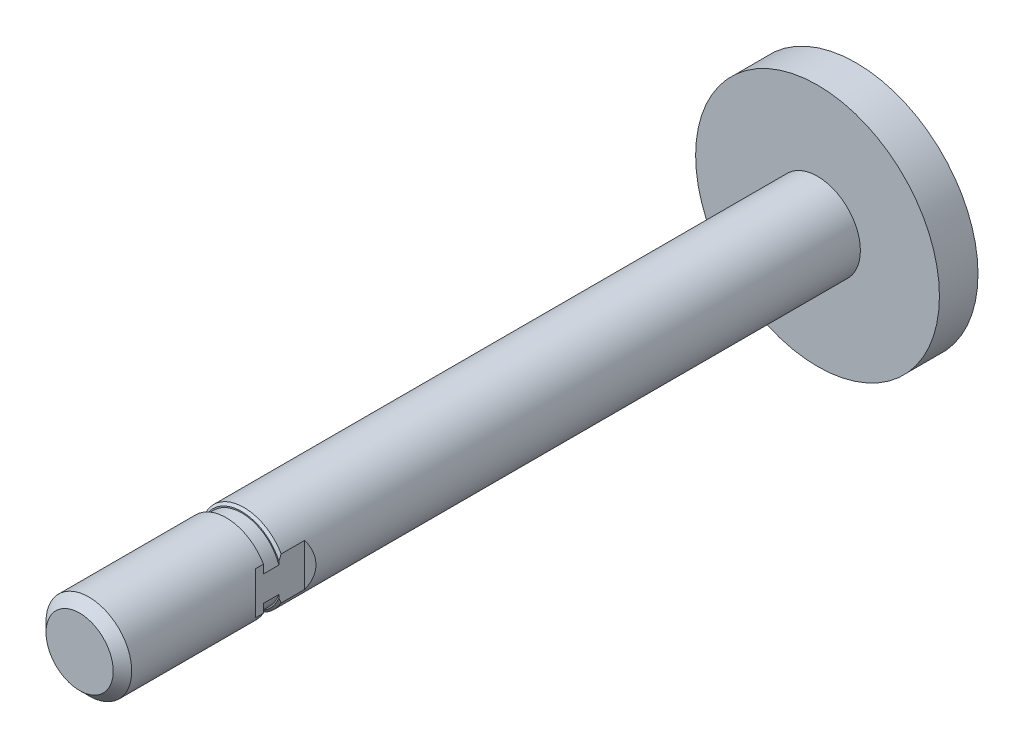
ISO-10303-21;
HEADER;
FILE_DESCRIPTION(('STEP AP214'),'2;1');
FILE_NAME('part.step','',(''),(''),'','','');
FILE_SCHEMA(('AUTOMOTIVE_DESIGN { 1 0 10303 214 1 1 1 1 }'));
ENDSEC;
DATA;
#1=APPLICATION_CONTEXT('core data for automotive mechanical design processes');
#2=APPLICATION_PROTOCOL_DEFINITION('international standard','automotive_design',2000,#1);
#3=PRODUCT_CONTEXT('',#1,'mechanical');
#4=PRODUCT('Part','Part','',(#3));
#5=PRODUCT_RELATED_PRODUCT_CATEGORY('part','',(#4));
#6=PRODUCT_DEFINITION_FORMATION('','',#4);
#7=PRODUCT_DEFINITION_CONTEXT('part definition',#1,'design');
#8=PRODUCT_DEFINITION('design','',#6,#7);
#9=PRODUCT_DEFINITION_SHAPE('','',#8);
#10=(LENGTH_UNIT() NAMED_UNIT(*) SI_UNIT(.MILLI.,.METRE.));
#11=(NAMED_UNIT(*) PLANE_ANGLE_UNIT() SI_UNIT($,.RADIAN.));
#12=(NAMED_UNIT(*) SI_UNIT($,.STERADIAN.) SOLID_ANGLE_UNIT());
#13=UNCERTAINTY_MEASURE_WITH_UNIT(LENGTH_MEASURE(1.E-05),#10,'distance_accuracy_value','');
#14=(GEOMETRIC_REPRESENTATION_CONTEXT(3) GLOBAL_UNCERTAINTY_ASSIGNED_CONTEXT((#13)) GLOBAL_UNIT_ASSIGNED_CONTEXT((#10,
#11,#12)) REPRESENTATION_CONTEXT('',''));
#15=CARTESIAN_POINT('',(0.,0.,0.));
#16=DIRECTION('',(0.,0.,1.));
#17=DIRECTION('',(1.,0.,0.));
#18=AXIS2_PLACEMENT_3D('',#15,#16,#17);
#19=CARTESIAN_POINT('',(0.,0.,116.35974110509));
#20=DIRECTION('',(0.,0.,-1.));
#21=DIRECTION('',(-1.,0.,0.));
#22=AXIS2_PLACEMENT_3D('',#19,#20,#21);
#23=CYLINDRICAL_SURFACE('',#22,5.556);
#24=CARTESIAN_POINT('',(0.,0.,99.445));
#25=DIRECTION('',(0.,0.,-1.));
#26=DIRECTION('',(-1.,0.,0.));
#27=AXIS2_PLACEMENT_3D('',#24,#25,#26);
#28=CIRCLE('',#27,5.556);
#29=CARTESIAN_POINT('',(-5.556,0.,99.445));
#30=VERTEX_POINT('',#29);
#31=EDGE_CURVE('E163',#30,#30,#28,.T.);
#32=ORIENTED_EDGE('',*,*,#31,.T.);
#33=EDGE_LOOP('',(#32));
#34=FACE_BOUND('',#33,.T.);
#35=DIRECTION('',(0.,0.,-1.));
#36=VECTOR('',#35,1.);
#37=CARTESIAN_POINT('',(4.826,-2.75297293847942,116.35974110509));
#38=LINE('',#37,#36);
#39=CARTESIAN_POINT('',(4.826,-2.75297293847942,82.645));
#40=VERTEX_POINT('',#39);
#41=CARTESIAN_POINT('',(4.826,-2.75297293847942,81.645));
#42=VERTEX_POINT('',#41);
#43=EDGE_CURVE('E332',#40,#42,#38,.T.);
#44=ORIENTED_EDGE('',*,*,#43,.F.);
#45=CARTESIAN_POINT('',(0.,0.,77.8189999999999));
#46=DIRECTION('',(0.707106781186551,0.,-0.707106781186544));
#47=DIRECTION('',(-0.707106781186544,0.,-0.707106781186551));
#48=AXIS2_PLACEMENT_3D('',#45,#46,#47);
#49=ELLIPSE('',#48,7.85737055254496,5.556);
#50=CARTESIAN_POINT('',(4.826,2.75297293847942,82.645));
#51=VERTEX_POINT('',#50);
#52=EDGE_CURVE('E500',#40,#51,#49,.F.);
#53=ORIENTED_EDGE('',*,*,#52,.T.);
#54=DIRECTION('',(0.,0.,-1.));
#55=VECTOR('',#54,1.);
#56=CARTESIAN_POINT('',(4.826,2.75297293847942,116.35974110509));
#57=LINE('',#56,#55);
#58=CARTESIAN_POINT('',(4.826,2.75297293847942,81.645));
#59=VERTEX_POINT('',#58);
#60=EDGE_CURVE('E501',#51,#59,#57,.T.);
#61=ORIENTED_EDGE('',*,*,#60,.T.);
#62=CARTESIAN_POINT('',(0.,0.,81.645));
#63=DIRECTION('',(0.,0.,1.));
#64=DIRECTION('',(1.,0.,0.));
#65=AXIS2_PLACEMENT_3D('',#62,#63,#64);
#66=CIRCLE('',#65,5.556);
#67=CARTESIAN_POINT('',(-4.826,2.75297293847942,81.645));
#68=VERTEX_POINT('',#67);
#69=EDGE_CURVE('E164',#59,#68,#66,.T.);
#70=ORIENTED_EDGE('',*,*,#69,.T.);
#71=DIRECTION('',(0.,0.,-1.));
#72=VECTOR('',#71,1.);
#73=CARTESIAN_POINT('',(-4.826,2.75297293847943,116.35974110509));
#74=LINE('',#73,#72);
#75=CARTESIAN_POINT('',(-4.826,2.75297293847942,82.645));
#76=VERTEX_POINT('',#75);
#77=EDGE_CURVE('E189',#68,#76,#74,.F.);
#78=ORIENTED_EDGE('',*,*,#77,.T.);
#79=CARTESIAN_POINT('',(0.,0.,77.8189999999999));
#80=DIRECTION('',(-0.707106781186551,0.,-0.707106781186544));
#81=DIRECTION('',(0.707106781186544,0.,-0.707106781186551));
#82=AXIS2_PLACEMENT_3D('',#79,#80,#81);
#83=ELLIPSE('',#82,7.85737055254496,5.556);
#84=CARTESIAN_POINT('',(-4.826,-2.75297293847942,82.645));
#85=VERTEX_POINT('',#84);
#86=EDGE_CURVE('E192',#76,#85,#83,.F.);
#87=ORIENTED_EDGE('',*,*,#86,.T.);
#88=DIRECTION('',(0.,0.,-1.));
#89=VECTOR('',#88,1.);
#90=CARTESIAN_POINT('',(-4.826,-2.75297293847943,116.35974110509));
#91=LINE('',#90,#89);
#92=CARTESIAN_POINT('',(-4.826,-2.75297293847942,81.645));
#93=VERTEX_POINT('',#92);
#94=EDGE_CURVE('E216',#93,#85,#91,.F.);
#95=ORIENTED_EDGE('',*,*,#94,.F.);
#96=EDGE_CURVE('E160',#93,#42,#66,.T.);
#97=ORIENTED_EDGE('',*,*,#96,.T.);
#98=EDGE_LOOP('',(#44,#53,#61,#70,#78,#87,#95,#97));
#99=FACE_BOUND('',#98,.T.);
#100=ADVANCED_FACE('F36',(#34,#99),#23,.T.);
#101=CARTESIAN_POINT('',(0.,0.,81.645));
#102=DIRECTION('',(0.,0.,1.));
#103=DIRECTION('',(1.,0.,0.));
#104=AXIS2_PLACEMENT_3D('',#101,#102,#103);
#105=PLANE('',#104);
#106=DIRECTION('',(0.,1.,0.));
#107=VECTOR('',#106,1.);
#108=CARTESIAN_POINT('',(4.826,-15.801,81.645));
#109=LINE('',#108,#107);
#110=CARTESIAN_POINT('',(4.826,-1.64915857333369,81.645));
#111=VERTEX_POINT('',#110);
#112=EDGE_CURVE('E345',#42,#111,#109,.T.);
#113=ORIENTED_EDGE('',*,*,#112,.F.);
#114=ORIENTED_EDGE('',*,*,#96,.F.);
#115=DIRECTION('',(0.,-1.,0.));
#116=VECTOR('',#115,1.);
#117=CARTESIAN_POINT('',(-4.826,-15.801,81.645));
#118=LINE('',#117,#116);
#119=CARTESIAN_POINT('',(-4.826,-1.64915857333368,81.645));
#120=VERTEX_POINT('',#119);
#121=EDGE_CURVE('E243',#120,#93,#118,.T.);
#122=ORIENTED_EDGE('',*,*,#121,.F.);
#123=CARTESIAN_POINT('',(0.,0.,81.645));
#124=DIRECTION('',(0.,0.,1.));
#125=DIRECTION('',(1.,0.,0.));
#126=AXIS2_PLACEMENT_3D('',#123,#124,#125);
#127=CIRCLE('',#126,5.1);
#128=EDGE_CURVE('E174',#120,#111,#127,.T.);
#129=ORIENTED_EDGE('',*,*,#128,.T.);
#130=EDGE_LOOP('',(#113,#114,#122,#129));
#131=FACE_BOUND('',#130,.T.);
#132=ADVANCED_FACE('F267',(#131),#105,.F.);
#133=DIRECTION('',(0.,-1.,0.));
#134=VECTOR('',#133,1.);
#135=CARTESIAN_POINT('',(4.826,15.801,81.645));
#136=LINE('',#135,#134);
#137=CARTESIAN_POINT('',(4.826,1.64915857333369,81.645));
#138=VERTEX_POINT('',#137);
#139=EDGE_CURVE('E294',#59,#138,#136,.T.);
#140=ORIENTED_EDGE('',*,*,#139,.T.);
#141=CARTESIAN_POINT('',(-4.826,1.64915857333368,81.645));
#142=VERTEX_POINT('',#141);
#143=EDGE_CURVE('E177',#138,#142,#127,.T.);
#144=ORIENTED_EDGE('',*,*,#143,.T.);
#145=DIRECTION('',(0.,1.,0.));
#146=VECTOR('',#145,1.);
#147=CARTESIAN_POINT('',(-4.826,15.801,81.645));
#148=LINE('',#147,#146);
#149=EDGE_CURVE('E195',#142,#68,#148,.T.);
#150=ORIENTED_EDGE('',*,*,#149,.T.);
#151=ORIENTED_EDGE('',*,*,#69,.F.);
#152=EDGE_LOOP('',(#140,#144,#150,#151));
#153=FACE_BOUND('',#152,.T.);
#154=ADVANCED_FACE('F273',(#153),#105,.F.);
#155=CARTESIAN_POINT('',(0.,0.,79.645));
#156=DIRECTION('',(0.,0.,1.));
#157=DIRECTION('',(1.,0.,0.));
#158=AXIS2_PLACEMENT_3D('',#155,#156,#157);
#159=PLANE('',#158);
#160=CARTESIAN_POINT('',(0.,0.,79.645));
#161=DIRECTION('',(0.,0.,1.));
#162=DIRECTION('',(1.,0.,0.));
#163=AXIS2_PLACEMENT_3D('',#160,#161,#162);
#164=CIRCLE('',#163,5.256);
#165=CARTESIAN_POINT('',(-4.826,-2.08212871840336,79.645));
#166=VERTEX_POINT('',#165);
#167=CARTESIAN_POINT('',(4.826,-2.08212871840335,79.645));
#168=VERTEX_POINT('',#167);
#169=EDGE_CURVE('E156',#166,#168,#164,.T.);
#170=ORIENTED_EDGE('',*,*,#169,.T.);
#171=DIRECTION('',(0.,1.,0.));
#172=VECTOR('',#171,1.);
#173=CARTESIAN_POINT('',(4.826,-15.801,79.645));
#174=LINE('',#173,#172);
#175=CARTESIAN_POINT('',(4.826,-1.64915857333369,79.645));
#176=VERTEX_POINT('',#175);
#177=EDGE_CURVE('E144',#168,#176,#174,.T.);
#178=ORIENTED_EDGE('',*,*,#177,.T.);
#179=CARTESIAN_POINT('',(0.,0.,79.645));
#180=DIRECTION('',(0.,0.,1.));
#181=DIRECTION('',(1.,0.,0.));
#182=AXIS2_PLACEMENT_3D('',#179,#180,#181);
#183=CIRCLE('',#182,5.1);
#184=CARTESIAN_POINT('',(-4.826,-1.64915857333369,79.645));
#185=VERTEX_POINT('',#184);
#186=EDGE_CURVE('E173',#176,#185,#183,.F.);
#187=ORIENTED_EDGE('',*,*,#186,.T.);
#188=DIRECTION('',(0.,-1.,0.));
#189=VECTOR('',#188,1.);
#190=CARTESIAN_POINT('',(-4.826,-15.801,79.645));
#191=LINE('',#190,#189);
#192=EDGE_CURVE('E241',#185,#166,#191,.T.);
#193=ORIENTED_EDGE('',*,*,#192,.T.);
#194=EDGE_LOOP('',(#170,#178,#187,#193));
#195=FACE_BOUND('',#194,.T.);
#196=ADVANCED_FACE('F353',(#195),#159,.T.);
#197=CARTESIAN_POINT('',(-4.826,1.64915857333368,79.645));
#198=VERTEX_POINT('',#197);
#199=CARTESIAN_POINT('',(4.826,1.64915857333369,79.645));
#200=VERTEX_POINT('',#199);
#201=EDGE_CURVE('E170',#198,#200,#183,.F.);
#202=ORIENTED_EDGE('',*,*,#201,.T.);
#203=DIRECTION('',(0.,-1.,0.));
#204=VECTOR('',#203,1.);
#205=CARTESIAN_POINT('',(4.826,15.801,79.645));
#206=LINE('',#205,#204);
#207=CARTESIAN_POINT('',(4.826,2.08212871840335,79.645));
#208=VERTEX_POINT('',#207);
#209=EDGE_CURVE('E304',#208,#200,#206,.T.);
#210=ORIENTED_EDGE('',*,*,#209,.F.);
#211=CARTESIAN_POINT('',(-4.826,2.08212871840335,79.645));
#212=VERTEX_POINT('',#211);
#213=EDGE_CURVE('E157',#208,#212,#164,.T.);
#214=ORIENTED_EDGE('',*,*,#213,.T.);
#215=DIRECTION('',(0.,1.,0.));
#216=VECTOR('',#215,1.);
#217=CARTESIAN_POINT('',(-4.826,15.801,79.645));
#218=LINE('',#217,#216);
#219=EDGE_CURVE('E198',#198,#212,#218,.T.);
#220=ORIENTED_EDGE('',*,*,#219,.F.);
#221=EDGE_LOOP('',(#202,#210,#214,#220));
#222=FACE_BOUND('',#221,.T.);
#223=ADVANCED_FACE('F303',(#222),#159,.T.);
#224=CARTESIAN_POINT('',(0.,0.,63.7731114838592));
#225=DIRECTION('',(0.,0.,1.));
#226=DIRECTION('',(1.,0.,0.));
#227=AXIS2_PLACEMENT_3D('',#224,#225,#226);
#228=CYLINDRICAL_SURFACE('',#227,5.1);
#229=ORIENTED_EDGE('',*,*,#143,.F.);
#230=DIRECTION('',(0.,0.,1.));
#231=VECTOR('',#230,1.);
#232=CARTESIAN_POINT('',(4.826,1.64915857333369,63.7731114838592));
#233=LINE('',#232,#231);
#234=EDGE_CURVE('E300',#200,#138,#233,.T.);
#235=ORIENTED_EDGE('',*,*,#234,.F.);
#236=ORIENTED_EDGE('',*,*,#201,.F.);
#237=DIRECTION('',(0.,0.,1.));
#238=VECTOR('',#237,1.);
#239=CARTESIAN_POINT('',(-4.826,1.64915857333368,63.7731114838592));
#240=LINE('',#239,#238);
#241=EDGE_CURVE('E201',#142,#198,#240,.F.);
#242=ORIENTED_EDGE('',*,*,#241,.F.);
#243=EDGE_LOOP('',(#229,#235,#236,#242));
#244=FACE_BOUND('',#243,.T.);
#245=ADVANCED_FACE('F284',(#244),#228,.T.);
#246=ORIENTED_EDGE('',*,*,#186,.F.);
#247=DIRECTION('',(0.,0.,1.));
#248=VECTOR('',#247,1.);
#249=CARTESIAN_POINT('',(4.826,-1.64915857333369,63.7731114838592));
#250=LINE('',#249,#248);
#251=EDGE_CURVE('E152',#176,#111,#250,.T.);
#252=ORIENTED_EDGE('',*,*,#251,.T.);
#253=ORIENTED_EDGE('',*,*,#128,.F.);
#254=DIRECTION('',(0.,0.,1.));
#255=VECTOR('',#254,1.);
#256=CARTESIAN_POINT('',(-4.826,-1.64915857333368,63.7731114838592));
#257=LINE('',#256,#255);
#258=EDGE_CURVE('E238',#120,#185,#257,.F.);
#259=ORIENTED_EDGE('',*,*,#258,.T.);
#260=EDGE_LOOP('',(#246,#252,#253,#259));
#261=FACE_BOUND('',#260,.T.);
#262=ADVANCED_FACE('F277',(#261),#228,.T.);
#263=CARTESIAN_POINT('',(0.,0.,5.));
#264=DIRECTION('',(0.,0.,1.));
#265=DIRECTION('',(1.,0.,0.));
#266=AXIS2_PLACEMENT_3D('',#263,#264,#265);
#267=CIRCLE('',#266,5.556);
#268=CARTESIAN_POINT('',(5.556,0.,5.));
#269=VERTEX_POINT('',#268);
#270=EDGE_CURVE('E40',#269,#269,#267,.T.);
#271=ORIENTED_EDGE('',*,*,#270,.T.);
#272=EDGE_LOOP('',(#271));
#273=FACE_BOUND('',#272,.T.);
#274=DIRECTION('',(0.,0.,-1.));
#275=VECTOR('',#274,1.);
#276=CARTESIAN_POINT('',(4.826,-2.75297293847942,116.35974110509));
#277=LINE('',#276,#275);
#278=CARTESIAN_POINT('',(4.826,-2.75297293847942,79.345));
#279=VERTEX_POINT('',#278);
#280=CARTESIAN_POINT('',(4.826,-2.75297293847942,76.295));
#281=VERTEX_POINT('',#280);
#282=EDGE_CURVE('E141',#279,#281,#277,.T.);
#283=ORIENTED_EDGE('',*,*,#282,.F.);
#284=CARTESIAN_POINT('',(0.,0.,79.345));
#285=DIRECTION('',(0.,0.,1.));
#286=DIRECTION('',(1.,0.,0.));
#287=AXIS2_PLACEMENT_3D('',#284,#285,#286);
#288=CIRCLE('',#287,5.556);
#289=CARTESIAN_POINT('',(-4.826,-2.75297293847942,79.345));
#290=VERTEX_POINT('',#289);
#291=EDGE_CURVE('E45',#279,#290,#288,.F.);
#292=ORIENTED_EDGE('',*,*,#291,.T.);
#293=DIRECTION('',(0.,0.,-1.));
#294=VECTOR('',#293,1.);
#295=CARTESIAN_POINT('',(-4.826,-2.75297293847943,116.35974110509));
#296=LINE('',#295,#294);
#297=CARTESIAN_POINT('',(-4.826,-2.75297293847943,76.295));
#298=VERTEX_POINT('',#297);
#299=EDGE_CURVE('E234',#298,#290,#296,.F.);
#300=ORIENTED_EDGE('',*,*,#299,.F.);
#301=CARTESIAN_POINT('',(0.,0.,81.121));
#302=DIRECTION('',(-0.707106781186552,0.,0.707106781186543));
#303=DIRECTION('',(-0.707106781186543,0.,-0.707106781186552));
#304=AXIS2_PLACEMENT_3D('',#301,#302,#303);
#305=ELLIPSE('',#304,7.85737055254496,5.556);
#306=CARTESIAN_POINT('',(-4.826,2.75297293847942,76.295));
#307=VERTEX_POINT('',#306);
#308=EDGE_CURVE('E206',#298,#307,#305,.F.);
#309=ORIENTED_EDGE('',*,*,#308,.T.);
#310=DIRECTION('',(0.,0.,-1.));
#311=VECTOR('',#310,1.);
#312=CARTESIAN_POINT('',(-4.826,2.75297293847943,116.35974110509));
#313=LINE('',#312,#311);
#314=CARTESIAN_POINT('',(-4.826,2.75297293847942,79.345));
#315=VERTEX_POINT('',#314);
#316=EDGE_CURVE('E203',#307,#315,#313,.F.);
#317=ORIENTED_EDGE('',*,*,#316,.T.);
#318=CARTESIAN_POINT('',(4.826,2.75297293847942,79.345));
#319=VERTEX_POINT('',#318);
#320=EDGE_CURVE('E13',#315,#319,#288,.F.);
#321=ORIENTED_EDGE('',*,*,#320,.T.);
#322=DIRECTION('',(0.,0.,-1.));
#323=VECTOR('',#322,1.);
#324=CARTESIAN_POINT('',(4.826,2.75297293847942,116.35974110509));
#325=LINE('',#324,#323);
#326=CARTESIAN_POINT('',(4.826,2.75297293847942,76.295));
#327=VERTEX_POINT('',#326);
#328=EDGE_CURVE('E52',#319,#327,#325,.T.);
#329=ORIENTED_EDGE('',*,*,#328,.T.);
#330=CARTESIAN_POINT('',(0.,0.,81.121));
#331=DIRECTION('',(0.707106781186551,0.,0.707106781186544));
#332=DIRECTION('',(0.707106781186544,0.,-0.707106781186551));
#333=AXIS2_PLACEMENT_3D('',#330,#331,#332);
#334=ELLIPSE('',#333,7.85737055254496,5.556);
#335=EDGE_CURVE('E151',#327,#281,#334,.F.);
#336=ORIENTED_EDGE('',*,*,#335,.T.);
#337=EDGE_LOOP('',(#283,#292,#300,#309,#317,#321,#329,#336));
#338=FACE_BOUND('',#337,.T.);
#339=ADVANCED_FACE('F149',(#273,#338),#23,.T.);
#340=CARTESIAN_POINT('',(0.,0.,79.645));
#341=DIRECTION('',(0.,0.,-1.));
#342=DIRECTION('',(-1.,0.,0.));
#343=AXIS2_PLACEMENT_3D('',#340,#341,#342);
#344=CONICAL_SURFACE('',#343,5.256,0.785398163397461);
#345=ORIENTED_EDGE('',*,*,#291,.F.);
#346=CARTESIAN_POINT('',(4.826,-7.47158823008884,76.0063439257045));
#347=CARTESIAN_POINT('',(4.826,-7.35397390622326,76.1051376054867));
#348=CARTESIAN_POINT('',(4.826,-7.23602515394072,76.2035328492115));
#349=CARTESIAN_POINT('',(4.826,-6.99936882011479,76.399410618652));
#350=CARTESIAN_POINT('',(4.826,-6.88066122480308,76.4968931277277));
#351=CARTESIAN_POINT('',(4.826,-6.52311558820286,76.7879194283197));
#352=CARTESIAN_POINT('',(4.826,-6.28300854161733,76.9799122631655));
#353=CARTESIAN_POINT('',(4.826,-5.78783180890128,77.3667894714264));
#354=CARTESIAN_POINT('',(4.826,-5.53256930373414,77.561427812222));
#355=CARTESIAN_POINT('',(4.826,-5.01605422819513,77.9425106953801));
#356=CARTESIAN_POINT('',(4.826,-4.75480341673716,78.128957598006));
#357=CARTESIAN_POINT('',(4.826,-4.35646903947555,78.4002554722074));
#358=CARTESIAN_POINT('',(4.826,-4.22235238144412,78.4894548699457));
#359=CARTESIAN_POINT('',(4.826,-3.95182457039685,78.6642933599959));
#360=CARTESIAN_POINT('',(4.826,-3.81541339498395,78.7499324175265));
#361=CARTESIAN_POINT('',(4.826,-3.5398421500565,78.9169578529155));
#362=CARTESIAN_POINT('',(4.826,-3.40068073328833,78.9983420715483));
#363=CARTESIAN_POINT('',(4.826,-3.11937528973698,79.1558154485987));
#364=CARTESIAN_POINT('',(4.826,-2.97722756436534,79.2318974672665));
#365=CARTESIAN_POINT('',(4.826,-2.26971138427722,79.5900899798368));
#366=CARTESIAN_POINT('',(4.826,-1.67550995361332,79.8280485237013));
#367=CARTESIAN_POINT('',(4.826,-0.904364090072454,79.9933149079225));
#368=CARTESIAN_POINT('',(4.826,-0.748544257772645,80.019775764175));
#369=CARTESIAN_POINT('',(4.826,-0.43506598556118,80.0579228623536));
#370=CARTESIAN_POINT('',(4.826,-0.277407651993765,80.0696099546007));
#371=CARTESIAN_POINT('',(4.826,0.0383006667571276,80.077428825884));
#372=CARTESIAN_POINT('',(4.826,0.196350659332347,80.0735603090715));
#373=CARTESIAN_POINT('',(4.826,0.511324142594397,80.0505314653462));
#374=CARTESIAN_POINT('',(4.826,0.668247548313581,80.0313699970074));
#375=CARTESIAN_POINT('',(4.826,0.978014879241888,79.9792418556265));
#376=CARTESIAN_POINT('',(4.826,1.13088448559799,79.9464250303719));
#377=CARTESIAN_POINT('',(4.826,1.43353431390985,79.8687162161519));
#378=CARTESIAN_POINT('',(4.826,1.58331344598815,79.8238200431148));
#379=CARTESIAN_POINT('',(4.826,1.87988929477685,79.7236747567592));
#380=CARTESIAN_POINT('',(4.826,2.02667426621022,79.6683912802525));
#381=CARTESIAN_POINT('',(4.826,2.31672328475612,79.5493654173118));
#382=CARTESIAN_POINT('',(4.826,2.45998771044074,79.4856239451441));
#383=CARTESIAN_POINT('',(4.826,2.72728285774422,79.3587901868641));
#384=CARTESIAN_POINT('',(4.826,2.851664946919,79.2964307880124));
#385=CARTESIAN_POINT('',(4.826,3.09726598374819,79.1675410844123));
#386=CARTESIAN_POINT('',(4.826,3.21849982383085,79.1010392267624));
#387=CARTESIAN_POINT('',(4.826,3.33865607429542,79.0327037922043));
#388=B_SPLINE_CURVE_WITH_KNOTS('',3,(#346,#347,#348,#349,#350,#351,#352,#353,#354,#355,#356,
#357,#358,#359,#360,#361,#362,#363,#364,#365,#366,#367,#368,#369,#370,#371,#372,#373,#374,#375,
#376,#377,#378,#379,#380,#381,#382,#383,#384,#385,#386,#387),.UNSPECIFIED.,.F.,.F.,(4,2,2,2,2,2,
2,2,2,2,2,2,2,2,2,2,2,2,2,2,4),(0.,0.4608016354538,0.921611655471873,1.84383535129903,
2.80673961094724,3.76936457699892,4.25252483940214,4.73568982073244,5.2190976625816,
5.70314434556216,7.594589761699,8.06813354002511,8.5416500617501,9.01517558922349,
9.48873646271268,9.95723229028642,10.4258906058877,10.8961275381034,11.3663136814495,
11.783631613356,12.1983461120708),.UNSPECIFIED.);
#389=EDGE_CURVE('E138',#279,#168,#388,.T.);
#390=ORIENTED_EDGE('',*,*,#389,.T.);
#391=ORIENTED_EDGE('',*,*,#169,.F.);
#392=CARTESIAN_POINT('',(-4.826,3.33865607429542,79.0327037922043));
#393=CARTESIAN_POINT('',(-4.826,3.25178978816429,79.0821192081603));
#394=CARTESIAN_POINT('',(-4.826,3.16436854960664,79.1305574034896));
#395=CARTESIAN_POINT('',(-4.826,2.98829729272788,79.2252029974569));
#396=CARTESIAN_POINT('',(-4.826,2.89964694436946,79.2714097813827));
#397=CARTESIAN_POINT('',(-4.826,2.63105448458602,79.4065761404407));
#398=CARTESIAN_POINT('',(-4.826,2.44914195566792,79.4916945934268));
#399=CARTESIAN_POINT('',(-4.826,2.07707361959744,79.6497366417048));
#400=CARTESIAN_POINT('',(-4.826,1.88683893111773,79.7224767826262));
#401=CARTESIAN_POINT('',(-4.826,1.50071379492981,79.8503190899212));
#402=CARTESIAN_POINT('',(-4.826,1.30483286861964,79.9054492496673));
#403=CARTESIAN_POINT('',(-4.826,0.96498959315574,79.9814032627379));
#404=CARTESIAN_POINT('',(-4.826,0.822212743132605,80.0075298408898));
#405=CARTESIAN_POINT('',(-4.826,0.534913669084351,80.047527248675));
#406=CARTESIAN_POINT('',(-4.826,0.390391395703729,80.061397730915));
#407=CARTESIAN_POINT('',(-4.826,0.101775903053229,80.0760623722803));
#408=CARTESIAN_POINT('',(-4.826,-0.0423122637751351,80.0769548598662));
#409=CARTESIAN_POINT('',(-4.826,-0.329987233844023,80.065867591515));
#410=CARTESIAN_POINT('',(-4.826,-0.473574030324175,80.0538876626762));
#411=CARTESIAN_POINT('',(-4.826,-0.75863173253916,80.0177765331964));
#412=CARTESIAN_POINT('',(-4.826,-0.90010861114719,79.99369175071));
#413=CARTESIAN_POINT('',(-4.826,-1.18075784109582,79.9345496345604));
#414=CARTESIAN_POINT('',(-4.826,-1.31992956505803,79.8994893638081));
#415=CARTESIAN_POINT('',(-4.826,-1.5961420878251,79.8196252678139));
#416=CARTESIAN_POINT('',(-4.826,-1.73316945076023,79.7747754788232));
#417=CARTESIAN_POINT('',(-4.826,-2.00422392773445,79.6769002145024));
#418=CARTESIAN_POINT('',(-4.826,-2.13825133709758,79.6238755480204));
#419=CARTESIAN_POINT('',(-4.826,-2.47967061540422,79.4785216289186));
#420=CARTESIAN_POINT('',(-4.826,-2.68490365081588,79.3811317296831));
#421=CARTESIAN_POINT('',(-4.826,-3.08893252707407,79.1737224908372));
#422=CARTESIAN_POINT('',(-4.826,-3.28772404694471,79.0636948898505));
#423=CARTESIAN_POINT('',(-4.826,-3.68023045271901,78.8339574239364));
#424=CARTESIAN_POINT('',(-4.826,-3.87393197805206,78.7142249073655));
#425=CARTESIAN_POINT('',(-4.826,-4.25665713004349,78.4676489746916));
#426=CARTESIAN_POINT('',(-4.826,-4.44568182992448,78.3408072122251));
#427=CARTESIAN_POINT('',(-4.826,-4.82067925774585,78.0811123842106));
#428=CARTESIAN_POINT('',(-4.826,-5.00663640048434,77.9482369185479));
#429=CARTESIAN_POINT('',(-4.826,-5.37538833407853,77.6781663889252));
#430=CARTESIAN_POINT('',(-4.826,-5.55818297960293,77.5409711272633));
#431=CARTESIAN_POINT('',(-4.826,-5.92093061312259,77.2633239539801));
#432=CARTESIAN_POINT('',(-4.826,-6.1008867181319,77.1228761035657));
#433=CARTESIAN_POINT('',(-4.826,-6.45861066706701,76.8392350531293));
#434=CARTESIAN_POINT('',(-4.826,-6.63637856708693,76.6960419237237));
#435=CARTESIAN_POINT('',(-4.826,-6.9238157972545,76.4614845029636));
#436=CARTESIAN_POINT('',(-4.826,-7.03404411377964,76.3708033529307));
#437=CARTESIAN_POINT('',(-4.826,-7.25347189143004,76.1889747060308));
#438=CARTESIAN_POINT('',(-4.826,-7.36267359452031,76.0978299154768));
#439=CARTESIAN_POINT('',(-4.826,-7.47158823008885,76.0063439257045));
#440=B_SPLINE_CURVE_WITH_KNOTS('',3,(#392,#393,#394,#395,#396,#397,#398,#399,#400,#401,#402,
#403,#404,#405,#406,#407,#408,#409,#410,#411,#412,#413,#414,#415,#416,#417,#418,#419,#420,#421,
#422,#423,#424,#425,#426,#427,#428,#429,#430,#431,#432,#433,#434,#435,#436,#437,#438,#439),
.UNSPECIFIED.,.F.,.F.,(4,2,2,2,2,2,2,2,2,2,2,2,2,2,2,2,2,2,2,2,2,2,2,4),(0.,0.299802300753297,
0.599686725731009,1.20177660302203,1.81213205766074,2.42151238735573,2.85648904801207,
3.29147803747796,3.72316957781695,4.15486691668623,4.5849213255919,5.015090917469,
5.44732543659959,5.87951721650112,6.56038283325037,7.2416960985285,7.92464808605357,
8.6074418704674,9.29301945823141,9.97862846820454,10.6634232278432,11.3482003962123,
11.7764029316659,12.2031210871535),.UNSPECIFIED.);
#441=EDGE_CURVE('E155',#166,#290,#440,.T.);
#442=ORIENTED_EDGE('',*,*,#441,.T.);
#443=EDGE_LOOP('',(#345,#390,#391,#442));
#444=FACE_BOUND('',#443,.T.);
#445=ADVANCED_FACE('F38',(#444),#344,.T.);
#446=ORIENTED_EDGE('',*,*,#213,.F.);
#447=CARTESIAN_POINT('',(4.826,7.47158823008884,76.0063439257045));
#448=CARTESIAN_POINT('',(4.826,7.35397390622326,76.1051376054867));
#449=CARTESIAN_POINT('',(4.826,7.23602515394072,76.2035328492115));
#450=CARTESIAN_POINT('',(4.826,6.99936882011479,76.399410618652));
#451=CARTESIAN_POINT('',(4.826,6.88066122480308,76.4968931277277));
#452=CARTESIAN_POINT('',(4.826,6.52311558820286,76.7879194283197));
#453=CARTESIAN_POINT('',(4.826,6.28300854161733,76.9799122631655));
#454=CARTESIAN_POINT('',(4.826,5.78783180890128,77.3667894714264));
#455=CARTESIAN_POINT('',(4.826,5.53256930373414,77.561427812222));
#456=CARTESIAN_POINT('',(4.826,5.01605422819513,77.9425106953801));
#457=CARTESIAN_POINT('',(4.826,4.75480341673716,78.128957598006));
#458=CARTESIAN_POINT('',(4.826,4.35646903947555,78.4002554722074));
#459=CARTESIAN_POINT('',(4.826,4.22235238144412,78.4894548699457));
#460=CARTESIAN_POINT('',(4.826,3.95182457039685,78.6642933599959));
#461=CARTESIAN_POINT('',(4.826,3.81541339498395,78.7499324175265));
#462=CARTESIAN_POINT('',(4.826,3.5398421500565,78.9169578529155));
#463=CARTESIAN_POINT('',(4.826,3.40068073328833,78.9983420715483));
#464=CARTESIAN_POINT('',(4.826,3.11937528973698,79.1558154485987));
#465=CARTESIAN_POINT('',(4.826,2.97722756436534,79.2318974672665));
#466=CARTESIAN_POINT('',(4.826,2.26971138427722,79.5900899798368));
#467=CARTESIAN_POINT('',(4.826,1.67550995361332,79.8280485237013));
#468=CARTESIAN_POINT('',(4.826,0.904364090072454,79.9933149079225));
#469=CARTESIAN_POINT('',(4.826,0.748544257772645,80.019775764175));
#470=CARTESIAN_POINT('',(4.826,0.43506598556118,80.0579228623536));
#471=CARTESIAN_POINT('',(4.826,0.277407651993765,80.0696099546007));
#472=CARTESIAN_POINT('',(4.826,-0.0383006667571276,80.077428825884));
#473=CARTESIAN_POINT('',(4.826,-0.196350659332347,80.0735603090715));
#474=CARTESIAN_POINT('',(4.826,-0.511324142594397,80.0505314653462));
#475=CARTESIAN_POINT('',(4.826,-0.668247548313581,80.0313699970074));
#476=CARTESIAN_POINT('',(4.826,-0.978014879241888,79.9792418556265));
#477=CARTESIAN_POINT('',(4.826,-1.13088448559799,79.9464250303719));
#478=CARTESIAN_POINT('',(4.826,-1.43353431390985,79.8687162161519));
#479=CARTESIAN_POINT('',(4.826,-1.58331344598815,79.8238200431148));
#480=CARTESIAN_POINT('',(4.826,-1.87988929477685,79.7236747567592));
#481=CARTESIAN_POINT('',(4.826,-2.02667426621022,79.6683912802525));
#482=CARTESIAN_POINT('',(4.826,-2.31672328475612,79.5493654173118));
#483=CARTESIAN_POINT('',(4.826,-2.45998771044074,79.4856239451441));
#484=CARTESIAN_POINT('',(4.826,-2.72728285774422,79.3587901868641));
#485=CARTESIAN_POINT('',(4.826,-2.851664946919,79.2964307880124));
#486=CARTESIAN_POINT('',(4.826,-3.09726598374819,79.1675410844123));
#487=CARTESIAN_POINT('',(4.826,-3.21849982383085,79.1010392267624));
#488=CARTESIAN_POINT('',(4.826,-3.33865607429542,79.0327037922043));
#489=B_SPLINE_CURVE_WITH_KNOTS('',3,(#447,#448,#449,#450,#451,#452,#453,#454,#455,#456,#457,
#458,#459,#460,#461,#462,#463,#464,#465,#466,#467,#468,#469,#470,#471,#472,#473,#474,#475,#476,
#477,#478,#479,#480,#481,#482,#483,#484,#485,#486,#487,#488),.UNSPECIFIED.,.F.,.F.,(4,2,2,2,2,2,
2,2,2,2,2,2,2,2,2,2,2,2,2,2,4),(0.,0.4608016354538,0.921611655471873,1.84383535129903,
2.80673961094724,3.76936457699892,4.25252483940214,4.73568982073244,5.2190976625816,
5.70314434556216,7.594589761699,8.06813354002511,8.5416500617501,9.01517558922349,
9.48873646271268,9.95723229028642,10.4258906058877,10.8961275381034,11.3663136814495,
11.783631613356,12.1983461120708),.UNSPECIFIED.);
#490=EDGE_CURVE('E309',#319,#208,#489,.T.);
#491=ORIENTED_EDGE('',*,*,#490,.F.);
#492=ORIENTED_EDGE('',*,*,#320,.F.);
#493=CARTESIAN_POINT('',(-4.826,-3.33865607429542,79.0327037922043));
#494=CARTESIAN_POINT('',(-4.826,-3.25178978816429,79.0821192081603));
#495=CARTESIAN_POINT('',(-4.826,-3.16436854960664,79.1305574034896));
#496=CARTESIAN_POINT('',(-4.826,-2.98829729272788,79.2252029974569));
#497=CARTESIAN_POINT('',(-4.826,-2.89964694436946,79.2714097813827));
#498=CARTESIAN_POINT('',(-4.826,-2.63105448458602,79.4065761404407));
#499=CARTESIAN_POINT('',(-4.826,-2.44914195566792,79.4916945934268));
#500=CARTESIAN_POINT('',(-4.826,-2.07707361959744,79.6497366417048));
#501=CARTESIAN_POINT('',(-4.826,-1.88683893111773,79.7224767826262));
#502=CARTESIAN_POINT('',(-4.826,-1.50071379492981,79.8503190899212));
#503=CARTESIAN_POINT('',(-4.826,-1.30483286861964,79.9054492496673));
#504=CARTESIAN_POINT('',(-4.826,-0.96498959315574,79.9814032627379));
#505=CARTESIAN_POINT('',(-4.826,-0.822212743132605,80.0075298408898));
#506=CARTESIAN_POINT('',(-4.826,-0.534913669084351,80.047527248675));
#507=CARTESIAN_POINT('',(-4.826,-0.390391395703729,80.061397730915));
#508=CARTESIAN_POINT('',(-4.826,-0.101775903053229,80.0760623722803));
#509=CARTESIAN_POINT('',(-4.826,0.0423122637751351,80.0769548598662));
#510=CARTESIAN_POINT('',(-4.826,0.329987233844023,80.065867591515));
#511=CARTESIAN_POINT('',(-4.826,0.473574030324175,80.0538876626762));
#512=CARTESIAN_POINT('',(-4.826,0.75863173253916,80.0177765331964));
#513=CARTESIAN_POINT('',(-4.826,0.90010861114719,79.99369175071));
#514=CARTESIAN_POINT('',(-4.826,1.18075784109582,79.9345496345604));
#515=CARTESIAN_POINT('',(-4.826,1.31992956505803,79.8994893638081));
#516=CARTESIAN_POINT('',(-4.826,1.5961420878251,79.8196252678139));
#517=CARTESIAN_POINT('',(-4.826,1.73316945076023,79.7747754788232));
#518=CARTESIAN_POINT('',(-4.826,2.00422392773445,79.6769002145024));
#519=CARTESIAN_POINT('',(-4.826,2.13825133709758,79.6238755480204));
#520=CARTESIAN_POINT('',(-4.826,2.47967061540422,79.4785216289186));
#521=CARTESIAN_POINT('',(-4.826,2.68490365081588,79.3811317296831));
#522=CARTESIAN_POINT('',(-4.826,3.08893252707407,79.1737224908372));
#523=CARTESIAN_POINT('',(-4.826,3.28772404694471,79.0636948898505));
#524=CARTESIAN_POINT('',(-4.826,3.68023045271901,78.8339574239364));
#525=CARTESIAN_POINT('',(-4.826,3.87393197805206,78.7142249073655));
#526=CARTESIAN_POINT('',(-4.826,4.25665713004349,78.4676489746916));
#527=CARTESIAN_POINT('',(-4.826,4.44568182992448,78.3408072122251));
#528=CARTESIAN_POINT('',(-4.826,4.82067925774585,78.0811123842106));
#529=CARTESIAN_POINT('',(-4.826,5.00663640048434,77.9482369185479));
#530=CARTESIAN_POINT('',(-4.826,5.37538833407853,77.6781663889252));
#531=CARTESIAN_POINT('',(-4.826,5.55818297960293,77.5409711272633));
#532=CARTESIAN_POINT('',(-4.826,5.92093061312259,77.2633239539801));
#533=CARTESIAN_POINT('',(-4.826,6.1008867181319,77.1228761035657));
#534=CARTESIAN_POINT('',(-4.826,6.45861066706701,76.8392350531293));
#535=CARTESIAN_POINT('',(-4.826,6.63637856708693,76.6960419237237));
#536=CARTESIAN_POINT('',(-4.826,6.9238157972545,76.4614845029636));
#537=CARTESIAN_POINT('',(-4.826,7.03404411377964,76.3708033529307));
#538=CARTESIAN_POINT('',(-4.826,7.25347189143004,76.1889747060308));
#539=CARTESIAN_POINT('',(-4.826,7.36267359452031,76.0978299154768));
#540=CARTESIAN_POINT('',(-4.826,7.47158823008885,76.0063439257045));
#541=B_SPLINE_CURVE_WITH_KNOTS('',3,(#493,#494,#495,#496,#497,#498,#499,#500,#501,#502,#503,
#504,#505,#506,#507,#508,#509,#510,#511,#512,#513,#514,#515,#516,#517,#518,#519,#520,#521,#522,
#523,#524,#525,#526,#527,#528,#529,#530,#531,#532,#533,#534,#535,#536,#537,#538,#539,#540),
.UNSPECIFIED.,.F.,.F.,(4,2,2,2,2,2,2,2,2,2,2,2,2,2,2,2,2,2,2,2,2,2,2,4),(0.,0.299802300753297,
0.599686725731009,1.20177660302203,1.81213205766074,2.42151238735573,2.85648904801207,
3.29147803747796,3.72316957781695,4.15486691668623,4.5849213255919,5.015090917469,
5.44732543659959,5.87951721650112,6.56038283325037,7.2416960985285,7.92464808605357,
8.6074418704674,9.29301945823141,9.97862846820454,10.6634232278432,11.3482003962123,
11.7764029316659,12.2031210871535),.UNSPECIFIED.);
#542=EDGE_CURVE('E209',#212,#315,#541,.T.);
#543=ORIENTED_EDGE('',*,*,#542,.F.);
#544=EDGE_LOOP('',(#446,#491,#492,#543));
#545=FACE_BOUND('',#544,.T.);
#546=ADVANCED_FACE('F283',(#545),#344,.T.);
#547=CARTESIAN_POINT('',(0.,0.,100.645));
#548=DIRECTION('',(0.,0.,-1.));
#549=DIRECTION('',(0.,1.,0.));
#550=AXIS2_PLACEMENT_3D('',#547,#548,#549);
#551=PLANE('',#550);
#552=CARTESIAN_POINT('',(0.,0.,100.645));
#553=DIRECTION('',(0.,0.,-1.));
#554=DIRECTION('',(0.,1.,0.));
#555=AXIS2_PLACEMENT_3D('',#552,#553,#554);
#556=CIRCLE('',#555,4.35600000000003);
#557=CARTESIAN_POINT('',(0.,4.35600000000003,100.645));
#558=VERTEX_POINT('',#557);
#559=EDGE_CURVE('E165',#558,#558,#556,.F.);
#560=ORIENTED_EDGE('',*,*,#559,.T.);
#561=EDGE_LOOP('',(#560));
#562=FACE_BOUND('',#561,.T.);
#563=ADVANCED_FACE('F365',(#562),#551,.F.);
#564=CARTESIAN_POINT('',(0.,0.,99.445));
#565=DIRECTION('',(0.,0.,-1.));
#566=DIRECTION('',(-1.,0.,0.));
#567=AXIS2_PLACEMENT_3D('',#564,#565,#566);
#568=CONICAL_SURFACE('',#567,5.556,0.785398163397446);
#569=ORIENTED_EDGE('',*,*,#559,.F.);
#570=EDGE_LOOP('',(#569));
#571=FACE_BOUND('',#570,.T.);
#572=ORIENTED_EDGE('',*,*,#31,.F.);
#573=EDGE_LOOP('',(#572));
#574=FACE_BOUND('',#573,.T.);
#575=ADVANCED_FACE('F367',(#571,#574),#568,.T.);
#576=CARTESIAN_POINT('',(0.,0.,5.));
#577=DIRECTION('',(0.,0.,-1.));
#578=DIRECTION('',(-1.,0.,0.));
#579=AXIS2_PLACEMENT_3D('',#576,#577,#578);
#580=CYLINDRICAL_SURFACE('',#579,15.8);
#581=CARTESIAN_POINT('',(0.,0.,5.));
#582=DIRECTION('',(0.,0.,1.));
#583=DIRECTION('',(1.,0.,0.));
#584=AXIS2_PLACEMENT_3D('',#581,#582,#583);
#585=CIRCLE('',#584,15.8);
#586=CARTESIAN_POINT('',(15.8,0.,5.));
#587=VERTEX_POINT('',#586);
#588=EDGE_CURVE('E181',#587,#587,#585,.T.);
#589=ORIENTED_EDGE('',*,*,#588,.F.);
#590=EDGE_LOOP('',(#589));
#591=FACE_BOUND('',#590,.T.);
#592=CARTESIAN_POINT('',(0.,0.,0.));
#593=DIRECTION('',(0.,0.,1.));
#594=DIRECTION('',(1.,0.,0.));
#595=AXIS2_PLACEMENT_3D('',#592,#593,#594);
#596=CIRCLE('',#595,15.8);
#597=CARTESIAN_POINT('',(15.8,0.,0.));
#598=VERTEX_POINT('',#597);
#599=EDGE_CURVE('E178',#598,#598,#596,.T.);
#600=ORIENTED_EDGE('',*,*,#599,.T.);
#601=EDGE_LOOP('',(#600));
#602=FACE_BOUND('',#601,.T.);
#603=ADVANCED_FACE('F362',(#591,#602),#580,.T.);
#604=CARTESIAN_POINT('',(0.,0.,5.));
#605=DIRECTION('',(0.,0.,1.));
#606=DIRECTION('',(1.,0.,0.));
#607=AXIS2_PLACEMENT_3D('',#604,#605,#606);
#608=PLANE('',#607);
#609=ORIENTED_EDGE('',*,*,#270,.F.);
#610=EDGE_LOOP('',(#609));
#611=FACE_BOUND('',#610,.T.);
#612=ORIENTED_EDGE('',*,*,#588,.T.);
#613=EDGE_LOOP('',(#612));
#614=FACE_BOUND('',#613,.T.);
#615=ADVANCED_FACE('F262',(#611,#614),#608,.T.);
#616=CARTESIAN_POINT('',(0.,0.,0.));
#617=DIRECTION('',(0.,0.,1.));
#618=DIRECTION('',(1.,0.,0.));
#619=AXIS2_PLACEMENT_3D('',#616,#617,#618);
#620=PLANE('',#619);
#621=ORIENTED_EDGE('',*,*,#599,.F.);
#622=EDGE_LOOP('',(#621));
#623=FACE_BOUND('',#622,.T.);
#624=ADVANCED_FACE('F257',(#623),#620,.F.);
#625=CARTESIAN_POINT('',(-5.556,15.801,83.375));
#626=DIRECTION('',(-0.707106781186551,0.,-0.707106781186544));
#627=DIRECTION('',(-0.707106781186544,0.,0.707106781186551));
#628=AXIS2_PLACEMENT_3D('',#625,#626,#627);
#629=PLANE('',#628);
#630=DIRECTION('',(0.,-1.,0.));
#631=VECTOR('',#630,1.);
#632=CARTESIAN_POINT('',(-4.826,15.801,82.645));
#633=LINE('',#632,#631);
#634=EDGE_CURVE('E182',#76,#85,#633,.T.);
#635=ORIENTED_EDGE('',*,*,#634,.T.);
#636=ORIENTED_EDGE('',*,*,#86,.F.);
#637=EDGE_LOOP('',(#635,#636));
#638=FACE_BOUND('',#637,.T.);
#639=ADVANCED_FACE('F255',(#638),#629,.T.);
#640=CARTESIAN_POINT('',(-4.826,15.801,82.645));
#641=DIRECTION('',(-1.,0.,0.));
#642=DIRECTION('',(0.,0.,1.));
#643=AXIS2_PLACEMENT_3D('',#640,#641,#642);
#644=PLANE('',#643);
#645=ORIENTED_EDGE('',*,*,#149,.F.);
#646=ORIENTED_EDGE('',*,*,#241,.T.);
#647=ORIENTED_EDGE('',*,*,#219,.T.);
#648=ORIENTED_EDGE('',*,*,#542,.T.);
#649=ORIENTED_EDGE('',*,*,#316,.F.);
#650=DIRECTION('',(0.,-1.,0.));
#651=VECTOR('',#650,1.);
#652=CARTESIAN_POINT('',(-4.826,15.801,76.295));
#653=LINE('',#652,#651);
#654=EDGE_CURVE('E186',#307,#298,#653,.T.);
#655=ORIENTED_EDGE('',*,*,#654,.T.);
#656=ORIENTED_EDGE('',*,*,#299,.T.);
#657=ORIENTED_EDGE('',*,*,#441,.F.);
#658=ORIENTED_EDGE('',*,*,#192,.F.);
#659=ORIENTED_EDGE('',*,*,#258,.F.);
#660=ORIENTED_EDGE('',*,*,#121,.T.);
#661=ORIENTED_EDGE('',*,*,#94,.T.);
#662=ORIENTED_EDGE('',*,*,#634,.F.);
#663=ORIENTED_EDGE('',*,*,#77,.F.);
#664=EDGE_LOOP('',(#645,#646,#647,#648,#649,#655,#656,#657,#658,#659,#660,#661,#662,#663));
#665=FACE_BOUND('',#664,.T.);
#666=ADVANCED_FACE('F218',(#665),#644,.T.);
#667=CARTESIAN_POINT('',(-5.556,15.801,75.565));
#668=DIRECTION('',(-0.707106781186552,0.,0.707106781186543));
#669=DIRECTION('',(0.707106781186543,0.,0.707106781186552));
#670=AXIS2_PLACEMENT_3D('',#667,#668,#669);
#671=PLANE('',#670);
#672=ORIENTED_EDGE('',*,*,#654,.F.);
#673=ORIENTED_EDGE('',*,*,#308,.F.);
#674=EDGE_LOOP('',(#672,#673));
#675=FACE_BOUND('',#674,.T.);
#676=ADVANCED_FACE('F226',(#675),#671,.T.);
#677=CARTESIAN_POINT('',(5.556,15.801,75.565));
#678=DIRECTION('',(0.707106781186551,0.,0.707106781186544));
#679=DIRECTION('',(0.707106781186544,0.,-0.707106781186551));
#680=AXIS2_PLACEMENT_3D('',#677,#678,#679);
#681=PLANE('',#680);
#682=DIRECTION('',(0.,-1.,0.));
#683=VECTOR('',#682,1.);
#684=CARTESIAN_POINT('',(4.826,15.801,76.295));
#685=LINE('',#684,#683);
#686=EDGE_CURVE('E235',#327,#281,#685,.T.);
#687=ORIENTED_EDGE('',*,*,#686,.T.);
#688=ORIENTED_EDGE('',*,*,#335,.F.);
#689=EDGE_LOOP('',(#687,#688));
#690=FACE_BOUND('',#689,.T.);
#691=ADVANCED_FACE('F313',(#690),#681,.T.);
#692=CARTESIAN_POINT('',(4.826,15.801,82.645));
#693=DIRECTION('',(1.,0.,0.));
#694=DIRECTION('',(0.,0.,-1.));
#695=AXIS2_PLACEMENT_3D('',#692,#693,#694);
#696=PLANE('',#695);
#697=DIRECTION('',(0.,-1.,0.));
#698=VECTOR('',#697,1.);
#699=CARTESIAN_POINT('',(4.826,15.801,82.645));
#700=LINE('',#699,#698);
#701=EDGE_CURVE('E348',#51,#40,#700,.T.);
#702=ORIENTED_EDGE('',*,*,#701,.T.);
#703=ORIENTED_EDGE('',*,*,#43,.T.);
#704=ORIENTED_EDGE('',*,*,#112,.T.);
#705=ORIENTED_EDGE('',*,*,#251,.F.);
#706=ORIENTED_EDGE('',*,*,#177,.F.);
#707=ORIENTED_EDGE('',*,*,#389,.F.);
#708=ORIENTED_EDGE('',*,*,#282,.T.);
#709=ORIENTED_EDGE('',*,*,#686,.F.);
#710=ORIENTED_EDGE('',*,*,#328,.F.);
#711=ORIENTED_EDGE('',*,*,#490,.T.);
#712=ORIENTED_EDGE('',*,*,#209,.T.);
#713=ORIENTED_EDGE('',*,*,#234,.T.);
#714=ORIENTED_EDGE('',*,*,#139,.F.);
#715=ORIENTED_EDGE('',*,*,#60,.F.);
#716=EDGE_LOOP('',(#702,#703,#704,#705,#706,#707,#708,#709,#710,#711,#712,#713,#714,#715));
#717=FACE_BOUND('',#716,.T.);
#718=ADVANCED_FACE('F140',(#717),#696,.T.);
#719=CARTESIAN_POINT('',(5.556,15.801,83.375));
#720=DIRECTION('',(0.707106781186551,0.,-0.707106781186544));
#721=DIRECTION('',(-0.707106781186544,0.,-0.707106781186551));
#722=AXIS2_PLACEMENT_3D('',#719,#720,#721);
#723=PLANE('',#722);
#724=ORIENTED_EDGE('',*,*,#701,.F.);
#725=ORIENTED_EDGE('',*,*,#52,.F.);
#726=EDGE_LOOP('',(#724,#725));
#727=FACE_BOUND('',#726,.T.);
#728=ADVANCED_FACE('F321',(#727),#723,.T.);
#729=CLOSED_SHELL('',(#100,#132,#154,#196,#223,#245,#262,#339,#445,#546,#563,#575,#603,#615,
#624,#639,#666,#676,#691,#718,#728));
#730=MANIFOLD_SOLID_BREP('B2',#729);
#731=ADVANCED_BREP_SHAPE_REPRESENTATION('',(#18,#730),#14);
#732=SHAPE_DEFINITION_REPRESENTATION(#9,#731);
ENDSEC;
END-ISO-10303-21;
